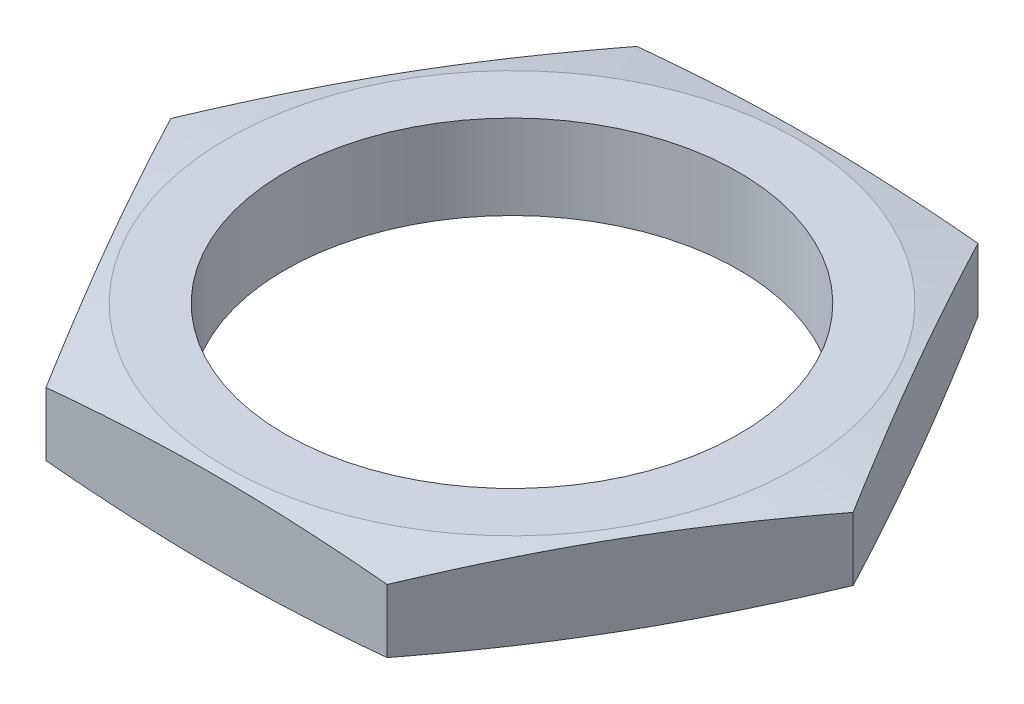
ISO-10303-21;
HEADER;
FILE_DESCRIPTION(('STEP AP214'),'2;1');
FILE_NAME('part.step','',(''),(''),'','','');
FILE_SCHEMA(('AUTOMOTIVE_DESIGN { 1 0 10303 214 1 1 1 1 }'));
ENDSEC;
DATA;
#1=APPLICATION_CONTEXT('core data for automotive mechanical design processes');
#2=APPLICATION_PROTOCOL_DEFINITION('international standard','automotive_design',2000,#1);
#3=PRODUCT_CONTEXT('',#1,'mechanical');
#4=PRODUCT('Part','Part','',(#3));
#5=PRODUCT_RELATED_PRODUCT_CATEGORY('part','',(#4));
#6=PRODUCT_DEFINITION_FORMATION('','',#4);
#7=PRODUCT_DEFINITION_CONTEXT('part definition',#1,'design');
#8=PRODUCT_DEFINITION('design','',#6,#7);
#9=PRODUCT_DEFINITION_SHAPE('','',#8);
#10=(LENGTH_UNIT() NAMED_UNIT(*) SI_UNIT(.MILLI.,.METRE.));
#11=(NAMED_UNIT(*) PLANE_ANGLE_UNIT() SI_UNIT($,.RADIAN.));
#12=(NAMED_UNIT(*) SI_UNIT($,.STERADIAN.) SOLID_ANGLE_UNIT());
#13=UNCERTAINTY_MEASURE_WITH_UNIT(LENGTH_MEASURE(1.E-05),#10,'distance_accuracy_value','');
#14=(GEOMETRIC_REPRESENTATION_CONTEXT(3) GLOBAL_UNCERTAINTY_ASSIGNED_CONTEXT((#13)) GLOBAL_UNIT_ASSIGNED_CONTEXT((#10,
#11,#12)) REPRESENTATION_CONTEXT('',''));
#15=CARTESIAN_POINT('',(0.,0.,0.));
#16=DIRECTION('',(0.,0.,1.));
#17=DIRECTION('',(1.,0.,0.));
#18=AXIS2_PLACEMENT_3D('',#15,#16,#17);
#19=CARTESIAN_POINT('',(16.1658075373095,4.,0.));
#20=DIRECTION('',(-0.866025403784439,0.,0.5));
#21=DIRECTION('',(0.5,0.,0.866025403784439));
#22=AXIS2_PLACEMENT_3D('',#19,#20,#21);
#23=PLANE('',#22);
#24=CARTESIAN_POINT('',(8.08278829860093,0.500021657844649,-14.0002));
#25=CARTESIAN_POINT('',(8.41903128372331,0.436928948181586,-13.4178100660794));
#26=CARTESIAN_POINT('',(8.7555755846297,0.379722239765142,-12.8348982379118));
#27=CARTESIAN_POINT('',(9.42924728603499,0.279299872724427,-11.6680646234564));
#28=CARTESIAN_POINT('',(9.76637478676281,0.236086923513849,-11.0841426635672));
#29=CARTESIAN_POINT('',(10.4402065165585,0.165986384294411,-9.91703187180905));
#30=CARTESIAN_POINT('',(10.7769096465145,0.139057616535367,-9.33384494365771));
#31=CARTESIAN_POINT('',(11.4505270834686,0.1029553465696,-8.16710531798885));
#32=CARTESIAN_POINT('',(11.7874413682254,0.0937802135004517,-7.58355265899443));
#33=CARTESIAN_POINT('',(12.4612699377389,0.0937802135004518,-6.41644734100557));
#34=CARTESIAN_POINT('',(12.7981842224956,0.1029553465696,-5.83289468201114));
#35=CARTESIAN_POINT('',(13.4718016594498,0.139057616535367,-4.66615505634229));
#36=CARTESIAN_POINT('',(13.8085047894058,0.16598638429441,-4.08296812819095));
#37=CARTESIAN_POINT('',(14.4823365192015,0.236086923513848,-2.91585733643283));
#38=CARTESIAN_POINT('',(14.8194640199293,0.279299872724427,-2.33193537654355));
#39=CARTESIAN_POINT('',(15.4931357213346,0.379722239765142,-1.16510176208821));
#40=CARTESIAN_POINT('',(15.829680022241,0.436928948181586,-0.582189933920597));
#41=CARTESIAN_POINT('',(16.1659230073634,0.500021657844649,0.000200000000002482));
#42=B_SPLINE_CURVE_WITH_KNOTS('',3,(#24,#25,#26,#27,#28,#29,#30,#31,#32,#33,#34,#35,#36,#37,#38,
#39,#40,#41),.UNSPECIFIED.,.F.,.F.,(4,2,2,2,2,2,2,2,4),(0.,2.02636732386575,4.0531267503307,
6.07473944983199,8.09616643363081,10.1175934174296,12.1392061169309,14.1659655433959,
16.1923328672616),.UNSPECIFIED.);
#43=CARTESIAN_POINT('',(8.08290376865475,0.5,-14.));
#44=VERTEX_POINT('',#43);
#45=CARTESIAN_POINT('',(16.1658075373095,0.5,0.));
#46=VERTEX_POINT('',#45);
#47=EDGE_CURVE('E50',#44,#46,#42,.T.);
#48=ORIENTED_EDGE('',*,*,#47,.F.);
#49=DIRECTION('',(0.,-1.,0.));
#50=VECTOR('',#49,1.);
#51=CARTESIAN_POINT('',(8.08290376865476,4.,-14.));
#52=LINE('',#51,#50);
#53=CARTESIAN_POINT('',(8.08290376865475,3.5,-14.));
#54=VERTEX_POINT('',#53);
#55=EDGE_CURVE('E11',#54,#44,#52,.T.);
#56=ORIENTED_EDGE('',*,*,#55,.F.);
#57=CARTESIAN_POINT('',(16.1659230073634,3.49997834215535,0.000200000000000044));
#58=CARTESIAN_POINT('',(15.829680022241,3.56307105181841,-0.582189933920598));
#59=CARTESIAN_POINT('',(15.4931357213346,3.62027776023486,-1.16510176208821));
#60=CARTESIAN_POINT('',(14.8194640199293,3.72070012727557,-2.33193537654355));
#61=CARTESIAN_POINT('',(14.4823365192015,3.76391307648615,-2.91585733643284));
#62=CARTESIAN_POINT('',(13.8085047894058,3.83401361570559,-4.08296812819095));
#63=CARTESIAN_POINT('',(13.4718016594498,3.86094238346463,-4.66615505634229));
#64=CARTESIAN_POINT('',(12.7981842224956,3.8970446534304,-5.83289468201115));
#65=CARTESIAN_POINT('',(12.4612699377389,3.90621978649955,-6.41644734100557));
#66=CARTESIAN_POINT('',(11.7874413682254,3.90621978649955,-7.58355265899443));
#67=CARTESIAN_POINT('',(11.4505270834686,3.8970446534304,-8.16710531798886));
#68=CARTESIAN_POINT('',(10.7769096465145,3.86094238346463,-9.33384494365771));
#69=CARTESIAN_POINT('',(10.4402065165585,3.83401361570559,-9.91703187180905));
#70=CARTESIAN_POINT('',(9.76637478676281,3.76391307648615,-11.0841426635672));
#71=CARTESIAN_POINT('',(9.42924728603499,3.72070012727557,-11.6680646234565));
#72=CARTESIAN_POINT('',(8.7555755846297,3.62027776023486,-12.8348982379118));
#73=CARTESIAN_POINT('',(8.41903128372331,3.56307105181841,-13.4178100660794));
#74=CARTESIAN_POINT('',(8.08278829860093,3.49997834215535,-14.0002));
#75=B_SPLINE_CURVE_WITH_KNOTS('',3,(#57,#58,#59,#60,#61,#62,#63,#64,#65,#66,#67,#68,#69,#70,#71,
#72,#73,#74),.UNSPECIFIED.,.F.,.F.,(4,2,2,2,2,2,2,2,4),(0.,2.02636732386574,4.0531267503307,
6.07473944983199,8.09616643363081,10.1175934174296,12.1392061169309,14.1659655433959,
16.1923328672616),.UNSPECIFIED.);
#76=CARTESIAN_POINT('',(16.1658075373095,3.5,0.));
#77=VERTEX_POINT('',#76);
#78=EDGE_CURVE('E106',#77,#54,#75,.T.);
#79=ORIENTED_EDGE('',*,*,#78,.F.);
#80=DIRECTION('',(0.,-1.,0.));
#81=VECTOR('',#80,1.);
#82=CARTESIAN_POINT('',(16.1658075373095,4.,0.));
#83=LINE('',#82,#81);
#84=EDGE_CURVE('E99',#77,#46,#83,.T.);
#85=ORIENTED_EDGE('',*,*,#84,.T.);
#86=EDGE_LOOP('',(#48,#56,#79,#85));
#87=FACE_BOUND('',#86,.T.);
#88=ADVANCED_FACE('F35',(#87),#23,.F.);
#89=CARTESIAN_POINT('',(8.08290376865476,4.,-14.));
#90=DIRECTION('',(0.,0.,1.));
#91=DIRECTION('',(1.,0.,0.));
#92=AXIS2_PLACEMENT_3D('',#89,#90,#91);
#93=PLANE('',#92);
#94=CARTESIAN_POINT('',(-21.3411155634247,2.25511134082577,-14.));
#95=CARTESIAN_POINT('',(-20.7058129429387,2.15550496916558,-14.));
#96=CARTESIAN_POINT('',(-20.0703097090309,2.05715550984232,-14.));
#97=CARTESIAN_POINT('',(-18.7988056075274,1.86363684383851,-14.));
#98=CARTESIAN_POINT('',(-18.1628047293868,1.76846770652341,-14.));
#99=CARTESIAN_POINT('',(-16.8899295173374,1.58193550887261,-14.));
#100=CARTESIAN_POINT('',(-16.2530549100121,1.4905743077123,-14.));
#101=CARTESIAN_POINT('',(-14.9786434654476,1.3125966688758,-14.));
#102=CARTESIAN_POINT('',(-14.3411066310614,1.22598021084411,-14.));
#103=CARTESIAN_POINT('',(-13.0676924405478,1.05891235972249,-14.));
#104=CARTESIAN_POINT('',(-12.4318180151575,0.97843873713209,-14.));
#105=CARTESIAN_POINT('',(-11.1591982105789,0.824641831680371,-14.));
#106=CARTESIAN_POINT('',(-10.5224528297147,0.751318562598315,-14.));
#107=CARTESIAN_POINT('',(-9.24805027735395,0.613449400079334,-14.));
#108=CARTESIAN_POINT('',(-8.61039317394871,0.548902882555688,-14.));
#109=CARTESIAN_POINT('',(-7.334081101819,0.430447372860344,-14.));
#110=CARTESIAN_POINT('',(-6.69542613343784,0.376538377029623,-14.));
#111=CARTESIAN_POINT('',(-5.41374366770995,0.281097514062404,-14.));
#112=CARTESIAN_POINT('',(-4.77071105422246,0.239633391712697,-14.));
#113=CARTESIAN_POINT('',(-3.48386041949211,0.171386901474243,-14.));
#114=CARTESIAN_POINT('',(-2.84004240609005,0.144604388198631,-14.));
#115=CARTESIAN_POINT('',(-1.55206224393307,0.107173239295152,-14.));
#116=CARTESIAN_POINT('',(-0.907900194322149,0.0965212566311662,-14.));
#117=CARTESIAN_POINT('',(0.38048384620744,0.091970753987886,-14.));
#118=CARTESIAN_POINT('',(1.02470583708786,0.0980722233911847,-14.));
#119=CARTESIAN_POINT('',(2.31392160660075,0.126689113047616,-14.));
#120=CARTESIAN_POINT('',(2.95891472669225,0.149233635445284,-14.));
#121=CARTESIAN_POINT('',(4.2481844986548,0.209506894102796,-14.));
#122=CARTESIAN_POINT('',(4.89246114382584,0.247235771179155,-14.));
#123=CARTESIAN_POINT('',(6.180268449355,0.336056103289326,-14.));
#124=CARTESIAN_POINT('',(6.82379883608137,0.387151467323396,-14.));
#125=CARTESIAN_POINT('',(8.10984993950409,0.500662396150294,-14.));
#126=CARTESIAN_POINT('',(8.75237065430104,0.563077982213137,-14.));
#127=CARTESIAN_POINT('',(10.0004580480839,0.693514810240626,-14.));
#128=CARTESIAN_POINT('',(10.6060785454299,0.761026161819565,-14.));
#129=CARTESIAN_POINT('',(11.8165159342086,0.902937684760817,-14.));
#130=CARTESIAN_POINT('',(12.4213328140225,0.977337954647116,-14.));
#131=CARTESIAN_POINT('',(13.6302733254929,1.13179414554823,-14.));
#132=CARTESIAN_POINT('',(14.2343969182125,1.21185036979902,-14.));
#133=CARTESIAN_POINT('',(15.4420068020443,1.37659600713995,-14.));
#134=CARTESIAN_POINT('',(16.0454930961187,1.46128539859772,-14.));
#135=CARTESIAN_POINT('',(17.2520165523451,1.63448378457692,-14.));
#136=CARTESIAN_POINT('',(17.8550536248724,1.7229934016864,-14.));
#137=CARTESIAN_POINT('',(19.0606583326001,1.90315868476258,-14.));
#138=CARTESIAN_POINT('',(19.6632259663328,1.99481436052576,-14.));
#139=CARTESIAN_POINT('',(21.4702857796518,2.27366275081374,-14.));
#140=CARTESIAN_POINT('',(22.6741778180284,2.4647430775665,-14.));
#141=CARTESIAN_POINT('',(25.0749930239485,2.85320630082681,-14.));
#142=CARTESIAN_POINT('',(26.2719218515873,3.05055444911091,-14.));
#143=CARTESIAN_POINT('',(28.6649218825801,3.45044386649273,-14.));
#144=CARTESIAN_POINT('',(29.8609930775925,3.65298518541461,-14.));
#145=CARTESIAN_POINT('',(32.2516442648111,4.06176446577771,-14.));
#146=CARTESIAN_POINT('',(33.4462247153245,4.26799975228896,-14.));
#147=CARTESIAN_POINT('',(35.2377050500015,4.57953237476335,-14.));
#148=CARTESIAN_POINT('',(35.8347949755792,4.68373895955804,-14.));
#149=CARTESIAN_POINT('',(37.0288619694167,4.89279477598603,-14.));
#150=CARTESIAN_POINT('',(37.625839037742,4.99764400724427,-14.));
#151=CARTESIAN_POINT('',(38.222766941432,5.10277237897569,-14.));
#152=B_SPLINE_CURVE_WITH_KNOTS('',3,(#94,#95,#96,#97,#98,#99,#100,#101,#102,#103,#104,#105,#106,
#107,#108,#109,#110,#111,#112,#113,#114,#115,#116,#117,#118,#119,#120,#121,#122,#123,#124,#125,
#126,#127,#128,#129,#130,#131,#132,#133,#134,#135,#136,#137,#138,#139,#140,#141,#142,#143,#144,
#145,#146,#147,#148,#149,#150,#151),.UNSPECIFIED.,.F.,.F.,(4,2,2,2,2,2,2,2,2,2,2,2,2,2,2,2,2,2,
2,2,2,2,2,2,2,2,2,2,4),(0.,1.92919491827861,3.85843188646111,5.78860000214864,7.7187598365368,
9.64156648555036,11.5643768398814,13.4870503977419,15.4097232942529,17.3426801364594,
19.2756178369214,21.208154403697,23.1406897457385,25.0766537588627,27.0126357261243,
28.9491845013061,30.885736915184,32.7138057489581,34.5419007314613,36.3700937991686,
38.1982783317241,40.0267619396983,41.8552512418766,45.5120996543971,49.15135323161,
52.7906417375313,56.4273936833893,58.2457384064187,60.0640820683674),.UNSPECIFIED.);
#153=CARTESIAN_POINT('',(-8.08290376865476,0.5,-14.));
#154=VERTEX_POINT('',#153);
#155=EDGE_CURVE('E86',#154,#44,#152,.T.);
#156=ORIENTED_EDGE('',*,*,#155,.F.);
#157=DIRECTION('',(0.,-1.,0.));
#158=VECTOR('',#157,1.);
#159=CARTESIAN_POINT('',(-8.08290376865476,4.,-14.));
#160=LINE('',#159,#158);
#161=CARTESIAN_POINT('',(-8.08290376865476,3.5,-14.));
#162=VERTEX_POINT('',#161);
#163=EDGE_CURVE('E43',#162,#154,#160,.T.);
#164=ORIENTED_EDGE('',*,*,#163,.F.);
#165=CARTESIAN_POINT('',(-21.3411155634247,1.74488865917423,-14.));
#166=CARTESIAN_POINT('',(-20.7058129429387,1.84449503083442,-14.));
#167=CARTESIAN_POINT('',(-20.0703097090309,1.94284449015768,-14.));
#168=CARTESIAN_POINT('',(-18.7988056075274,2.13636315616149,-14.));
#169=CARTESIAN_POINT('',(-18.1628047293868,2.23153229347659,-14.));
#170=CARTESIAN_POINT('',(-16.8899295173374,2.41806449112739,-14.));
#171=CARTESIAN_POINT('',(-16.2530549100121,2.5094256922877,-14.));
#172=CARTESIAN_POINT('',(-14.9786434654475,2.6874033311242,-14.));
#173=CARTESIAN_POINT('',(-14.3411066310614,2.77401978915589,-14.));
#174=CARTESIAN_POINT('',(-13.0676924405478,2.94108764027751,-14.));
#175=CARTESIAN_POINT('',(-12.4318180151575,3.02156126286791,-14.));
#176=CARTESIAN_POINT('',(-11.1591982105789,3.17535816831963,-14.));
#177=CARTESIAN_POINT('',(-10.5224528297147,3.24868143740169,-14.));
#178=CARTESIAN_POINT('',(-9.24805027735395,3.38655059992067,-14.));
#179=CARTESIAN_POINT('',(-8.61039317394871,3.45109711744431,-14.));
#180=CARTESIAN_POINT('',(-7.33408110181899,3.56955262713966,-14.));
#181=CARTESIAN_POINT('',(-6.69542613343784,3.62346162297038,-14.));
#182=CARTESIAN_POINT('',(-5.41374366770995,3.7189024859376,-14.));
#183=CARTESIAN_POINT('',(-4.77071105422246,3.7603666082873,-14.));
#184=CARTESIAN_POINT('',(-3.48386041949211,3.82861309852576,-14.));
#185=CARTESIAN_POINT('',(-2.84004240609005,3.85539561180137,-14.));
#186=CARTESIAN_POINT('',(-1.55206224393307,3.89282676070485,-14.));
#187=CARTESIAN_POINT('',(-0.90790019432215,3.90347874336883,-14.));
#188=CARTESIAN_POINT('',(0.380483846207441,3.90802924601211,-14.));
#189=CARTESIAN_POINT('',(1.02470583708786,3.90192777660881,-14.));
#190=CARTESIAN_POINT('',(2.31392160660075,3.87331088695238,-14.));
#191=CARTESIAN_POINT('',(2.95891472669226,3.85076636455472,-14.));
#192=CARTESIAN_POINT('',(4.2481844986548,3.7904931058972,-14.));
#193=CARTESIAN_POINT('',(4.89246114382584,3.75276422882084,-14.));
#194=CARTESIAN_POINT('',(6.180268449355,3.66394389671067,-14.));
#195=CARTESIAN_POINT('',(6.82379883608137,3.6128485326766,-14.));
#196=CARTESIAN_POINT('',(8.10984993950409,3.49933760384971,-14.));
#197=CARTESIAN_POINT('',(8.75237065430104,3.43692201778686,-14.));
#198=CARTESIAN_POINT('',(10.0004580480839,3.30648518975937,-14.));
#199=CARTESIAN_POINT('',(10.6060785454299,3.23897383818043,-14.));
#200=CARTESIAN_POINT('',(11.8165159342086,3.09706231523918,-14.));
#201=CARTESIAN_POINT('',(12.4213328140225,3.02266204535288,-14.));
#202=CARTESIAN_POINT('',(13.6302733254929,2.86820585445177,-14.));
#203=CARTESIAN_POINT('',(14.2343969182125,2.78814963020098,-14.));
#204=CARTESIAN_POINT('',(15.4420068020443,2.62340399286005,-14.));
#205=CARTESIAN_POINT('',(16.0454930961187,2.53871460140227,-14.));
#206=CARTESIAN_POINT('',(17.2520165523451,2.36551621542308,-14.));
#207=CARTESIAN_POINT('',(17.8550536248724,2.2770065983136,-14.));
#208=CARTESIAN_POINT('',(19.0606583326001,2.09684131523741,-14.));
#209=CARTESIAN_POINT('',(19.6632259663328,2.00518563947424,-14.));
#210=CARTESIAN_POINT('',(21.4702857796518,1.72633724918626,-14.));
#211=CARTESIAN_POINT('',(22.6741778180284,1.53525692243349,-14.));
#212=CARTESIAN_POINT('',(25.0749930239485,1.14679369917319,-14.));
#213=CARTESIAN_POINT('',(26.2719218515873,0.94944555088908,-14.));
#214=CARTESIAN_POINT('',(28.6649218825801,0.549556133507272,-14.));
#215=CARTESIAN_POINT('',(29.8609930775925,0.347014814585387,-14.));
#216=CARTESIAN_POINT('',(32.2516442648111,-0.061764465777715,-14.));
#217=CARTESIAN_POINT('',(33.4462247153245,-0.267999752288968,-14.));
#218=CARTESIAN_POINT('',(35.2377050500015,-0.579532374763347,-14.));
#219=CARTESIAN_POINT('',(35.8347949755792,-0.683738959558042,-14.));
#220=CARTESIAN_POINT('',(37.0288619694166,-0.892794775986026,-14.));
#221=CARTESIAN_POINT('',(37.625839037742,-0.997644007244269,-14.));
#222=CARTESIAN_POINT('',(38.222766941432,-1.10277237897569,-14.));
#223=B_SPLINE_CURVE_WITH_KNOTS('',3,(#165,#166,#167,#168,#169,#170,#171,#172,#173,#174,#175,
#176,#177,#178,#179,#180,#181,#182,#183,#184,#185,#186,#187,#188,#189,#190,#191,#192,#193,#194,
#195,#196,#197,#198,#199,#200,#201,#202,#203,#204,#205,#206,#207,#208,#209,#210,#211,#212,#213,
#214,#215,#216,#217,#218,#219,#220,#221,#222),.UNSPECIFIED.,.F.,.F.,(4,2,2,2,2,2,2,2,2,2,2,2,2,
2,2,2,2,2,2,2,2,2,2,2,2,2,2,2,4),(0.,1.92919491827861,3.85843188646112,5.78860000214865,
7.71875983653681,9.64156648555037,11.5643768398814,13.4870503977419,15.4097232942529,
17.3426801364594,19.2756178369214,21.208154403697,23.1406897457385,25.0766537588627,
27.0126357261243,28.9491845013061,30.885736915184,32.7138057489581,34.5419007314613,
36.3700937991686,38.1982783317241,40.0267619396983,41.8552512418766,45.5120996543972,
49.15135323161,52.7906417375313,56.4273936833893,58.2457384064187,60.0640820683674),.UNSPECIFIED.);
#224=EDGE_CURVE('E104',#54,#162,#223,.F.);
#225=ORIENTED_EDGE('',*,*,#224,.F.);
#226=ORIENTED_EDGE('',*,*,#55,.T.);
#227=EDGE_LOOP('',(#156,#164,#225,#226));
#228=FACE_BOUND('',#227,.T.);
#229=ADVANCED_FACE('F103',(#228),#93,.F.);
#230=CARTESIAN_POINT('',(-8.08290376865476,4.,-14.));
#231=DIRECTION('',(0.866025403784439,0.,0.5));
#232=DIRECTION('',(0.5,0.,-0.866025403784439));
#233=AXIS2_PLACEMENT_3D('',#230,#231,#232);
#234=PLANE('',#233);
#235=CARTESIAN_POINT('',(-16.1659230073634,0.500021657844648,0.000199999999996531));
#236=CARTESIAN_POINT('',(-15.829680022241,0.436928948181585,-0.582189933920602));
#237=CARTESIAN_POINT('',(-15.4931357213346,0.379722239765141,-1.16510176208822));
#238=CARTESIAN_POINT('',(-14.8194640199293,0.279299872724426,-2.33193537654355));
#239=CARTESIAN_POINT('',(-14.4823365192015,0.236086923513848,-2.91585733643284));
#240=CARTESIAN_POINT('',(-13.8085047894058,0.16598638429441,-4.08296812819095));
#241=CARTESIAN_POINT('',(-13.4718016594498,0.139057616535366,-4.6661550563423));
#242=CARTESIAN_POINT('',(-12.7981842224956,0.102955346569599,-5.83289468201115));
#243=CARTESIAN_POINT('',(-12.4612699377389,0.0937802135004515,-6.41644734100557));
#244=CARTESIAN_POINT('',(-11.7874413682254,0.0937802135004516,-7.58355265899443));
#245=CARTESIAN_POINT('',(-11.4505270834686,0.1029553465696,-8.16710531798886));
#246=CARTESIAN_POINT('',(-10.7769096465145,0.139057616535367,-9.33384494365771));
#247=CARTESIAN_POINT('',(-10.4402065165585,0.16598638429441,-9.91703187180905));
#248=CARTESIAN_POINT('',(-9.7663747867628,0.236086923513849,-11.0841426635672));
#249=CARTESIAN_POINT('',(-9.42924728603499,0.279299872724427,-11.6680646234565));
#250=CARTESIAN_POINT('',(-8.7555755846297,0.379722239765142,-12.8348982379118));
#251=CARTESIAN_POINT('',(-8.41903128372331,0.436928948181586,-13.4178100660794));
#252=CARTESIAN_POINT('',(-8.08278829860092,0.500021657844649,-14.0002));
#253=B_SPLINE_CURVE_WITH_KNOTS('',3,(#235,#236,#237,#238,#239,#240,#241,#242,#243,#244,#245,
#246,#247,#248,#249,#250,#251,#252),.UNSPECIFIED.,.F.,.F.,(4,2,2,2,2,2,2,2,4),(0.,
2.02636732386574,4.0531267503307,6.07473944983199,8.09616643363081,10.1175934174296,
12.1392061169309,14.1659655433959,16.1923328672616),.UNSPECIFIED.);
#254=CARTESIAN_POINT('',(-16.1658075373095,0.5,0.));
#255=VERTEX_POINT('',#254);
#256=EDGE_CURVE('E89',#255,#154,#253,.T.);
#257=ORIENTED_EDGE('',*,*,#256,.F.);
#258=DIRECTION('',(0.,-1.,0.));
#259=VECTOR('',#258,1.);
#260=CARTESIAN_POINT('',(-16.1658075373095,4.,0.));
#261=LINE('',#260,#259);
#262=CARTESIAN_POINT('',(-16.1658075373095,3.5,0.));
#263=VERTEX_POINT('',#262);
#264=EDGE_CURVE('E292',#263,#255,#261,.T.);
#265=ORIENTED_EDGE('',*,*,#264,.F.);
#266=CARTESIAN_POINT('',(-8.08278829860092,3.49997834215535,-14.0002));
#267=CARTESIAN_POINT('',(-8.41903128372331,3.56307105181841,-13.4178100660794));
#268=CARTESIAN_POINT('',(-8.7555755846297,3.62027776023486,-12.8348982379118));
#269=CARTESIAN_POINT('',(-9.42924728603499,3.72070012727557,-11.6680646234564));
#270=CARTESIAN_POINT('',(-9.7663747867628,3.76391307648615,-11.0841426635672));
#271=CARTESIAN_POINT('',(-10.4402065165585,3.83401361570559,-9.91703187180905));
#272=CARTESIAN_POINT('',(-10.7769096465145,3.86094238346463,-9.33384494365771));
#273=CARTESIAN_POINT('',(-11.4505270834686,3.8970446534304,-8.16710531798886));
#274=CARTESIAN_POINT('',(-11.7874413682254,3.90621978649955,-7.58355265899443));
#275=CARTESIAN_POINT('',(-12.4612699377389,3.90621978649955,-6.41644734100558));
#276=CARTESIAN_POINT('',(-12.7981842224956,3.8970446534304,-5.83289468201115));
#277=CARTESIAN_POINT('',(-13.4718016594498,3.86094238346463,-4.6661550563423));
#278=CARTESIAN_POINT('',(-13.8085047894058,3.83401361570559,-4.08296812819095));
#279=CARTESIAN_POINT('',(-14.4823365192015,3.76391307648615,-2.91585733643284));
#280=CARTESIAN_POINT('',(-14.8194640199293,3.72070012727557,-2.33193537654355));
#281=CARTESIAN_POINT('',(-15.4931357213346,3.62027776023486,-1.16510176208822));
#282=CARTESIAN_POINT('',(-15.829680022241,3.56307105181842,-0.582189933920603));
#283=CARTESIAN_POINT('',(-16.1659230073634,3.49997834215535,0.000199999999996623));
#284=B_SPLINE_CURVE_WITH_KNOTS('',3,(#266,#267,#268,#269,#270,#271,#272,#273,#274,#275,#276,
#277,#278,#279,#280,#281,#282,#283),.UNSPECIFIED.,.F.,.F.,(4,2,2,2,2,2,2,2,4),(0.,
2.02636732386575,4.0531267503307,6.07473944983199,8.09616643363082,10.1175934174296,
12.1392061169309,14.1659655433959,16.1923328672616),.UNSPECIFIED.);
#285=EDGE_CURVE('E107',#162,#263,#284,.T.);
#286=ORIENTED_EDGE('',*,*,#285,.F.);
#287=ORIENTED_EDGE('',*,*,#163,.T.);
#288=EDGE_LOOP('',(#257,#265,#286,#287));
#289=FACE_BOUND('',#288,.T.);
#290=ADVANCED_FACE('F132',(#289),#234,.F.);
#291=CARTESIAN_POINT('',(-16.1658075373095,4.,0.));
#292=DIRECTION('',(0.866025403784439,0.,-0.5));
#293=DIRECTION('',(-0.5,0.,-0.866025403784439));
#294=AXIS2_PLACEMENT_3D('',#291,#292,#293);
#295=PLANE('',#294);
#296=CARTESIAN_POINT('',(-8.08278829860091,0.500021657844648,14.0002));
#297=CARTESIAN_POINT('',(-8.4190312837233,0.436928948181585,13.4178100660794));
#298=CARTESIAN_POINT('',(-8.75557558462969,0.379722239765141,12.8348982379118));
#299=CARTESIAN_POINT('',(-9.42924728603498,0.279299872724426,11.6680646234565));
#300=CARTESIAN_POINT('',(-9.76637478676279,0.236086923513848,11.0841426635672));
#301=CARTESIAN_POINT('',(-10.4402065165585,0.16598638429441,9.91703187180905));
#302=CARTESIAN_POINT('',(-10.7769096465145,0.139057616535366,9.33384494365771));
#303=CARTESIAN_POINT('',(-11.4505270834686,0.102955346569599,8.16710531798886));
#304=CARTESIAN_POINT('',(-11.7874413682254,0.0937802135004503,7.58355265899443));
#305=CARTESIAN_POINT('',(-12.4612699377389,0.0937802135004503,6.41644734100557));
#306=CARTESIAN_POINT('',(-12.7981842224956,0.102955346569599,5.83289468201114));
#307=CARTESIAN_POINT('',(-13.4718016594498,0.139057616535366,4.66615505634229));
#308=CARTESIAN_POINT('',(-13.8085047894058,0.165986384294409,4.08296812819095));
#309=CARTESIAN_POINT('',(-14.4823365192015,0.236086923513847,2.91585733643283));
#310=CARTESIAN_POINT('',(-14.8194640199293,0.279299872724426,2.33193537654355));
#311=CARTESIAN_POINT('',(-15.4931357213346,0.379722239765141,1.16510176208821));
#312=CARTESIAN_POINT('',(-15.829680022241,0.436928948181585,0.582189933920595));
#313=CARTESIAN_POINT('',(-16.1659230073634,0.500021657844648,-0.000200000000004515));
#314=B_SPLINE_CURVE_WITH_KNOTS('',3,(#296,#297,#298,#299,#300,#301,#302,#303,#304,#305,#306,
#307,#308,#309,#310,#311,#312,#313),.UNSPECIFIED.,.F.,.F.,(4,2,2,2,2,2,2,2,4),(0.,
2.02636732386575,4.0531267503307,6.07473944983199,8.09616643363082,10.1175934174296,
12.1392061169309,14.1659655433959,16.1923328672616),.UNSPECIFIED.);
#315=CARTESIAN_POINT('',(-8.08290376865474,0.5,14.));
#316=VERTEX_POINT('',#315);
#317=EDGE_CURVE('E169',#316,#255,#314,.T.);
#318=ORIENTED_EDGE('',*,*,#317,.F.);
#319=DIRECTION('',(0.,-1.,0.));
#320=VECTOR('',#319,1.);
#321=CARTESIAN_POINT('',(-8.08290376865475,4.,14.));
#322=LINE('',#321,#320);
#323=CARTESIAN_POINT('',(-8.08290376865475,3.5,14.));
#324=VERTEX_POINT('',#323);
#325=EDGE_CURVE('E289',#324,#316,#322,.T.);
#326=ORIENTED_EDGE('',*,*,#325,.F.);
#327=CARTESIAN_POINT('',(-16.1659230073634,3.49997834215535,-0.000200000000003531));
#328=CARTESIAN_POINT('',(-15.829680022241,3.56307105181842,0.582189933920595));
#329=CARTESIAN_POINT('',(-15.4931357213346,3.62027776023486,1.16510176208821));
#330=CARTESIAN_POINT('',(-14.8194640199293,3.72070012727557,2.33193537654355));
#331=CARTESIAN_POINT('',(-14.4823365192015,3.76391307648615,2.91585733643283));
#332=CARTESIAN_POINT('',(-13.8085047894058,3.83401361570559,4.08296812819095));
#333=CARTESIAN_POINT('',(-13.4718016594498,3.86094238346463,4.66615505634229));
#334=CARTESIAN_POINT('',(-12.7981842224956,3.8970446534304,5.83289468201115));
#335=CARTESIAN_POINT('',(-12.4612699377389,3.90621978649955,6.41644734100557));
#336=CARTESIAN_POINT('',(-11.7874413682254,3.90621978649955,7.58355265899443));
#337=CARTESIAN_POINT('',(-11.4505270834686,3.8970446534304,8.16710531798886));
#338=CARTESIAN_POINT('',(-10.7769096465145,3.86094238346463,9.33384494365771));
#339=CARTESIAN_POINT('',(-10.4402065165585,3.83401361570559,9.91703187180905));
#340=CARTESIAN_POINT('',(-9.76637478676279,3.76391307648615,11.0841426635672));
#341=CARTESIAN_POINT('',(-9.42924728603498,3.72070012727557,11.6680646234565));
#342=CARTESIAN_POINT('',(-8.75557558462969,3.62027776023486,12.8348982379118));
#343=CARTESIAN_POINT('',(-8.4190312837233,3.56307105181841,13.4178100660794));
#344=CARTESIAN_POINT('',(-8.08278829860091,3.49997834215535,14.0002));
#345=B_SPLINE_CURVE_WITH_KNOTS('',3,(#327,#328,#329,#330,#331,#332,#333,#334,#335,#336,#337,
#338,#339,#340,#341,#342,#343,#344),.UNSPECIFIED.,.F.,.F.,(4,2,2,2,2,2,2,2,4),(0.,
2.02636732386575,4.0531267503307,6.074739449832,8.09616643363082,10.1175934174296,
12.1392061169309,14.1659655433959,16.1923328672616),.UNSPECIFIED.);
#346=EDGE_CURVE('E111',#263,#324,#345,.T.);
#347=ORIENTED_EDGE('',*,*,#346,.F.);
#348=ORIENTED_EDGE('',*,*,#264,.T.);
#349=EDGE_LOOP('',(#318,#326,#347,#348));
#350=FACE_BOUND('',#349,.T.);
#351=ADVANCED_FACE('F173',(#350),#295,.F.);
#352=CARTESIAN_POINT('',(-8.08290376865475,4.,14.));
#353=DIRECTION('',(0.,0.,-1.));
#354=DIRECTION('',(-1.,0.,0.));
#355=AXIS2_PLACEMENT_3D('',#352,#353,#354);
#356=PLANE('',#355);
#357=CARTESIAN_POINT('',(-21.3411112485993,2.25511066414589,14.));
#358=CARTESIAN_POINT('',(-20.7058088051596,2.15550432629498,14.));
#359=CARTESIAN_POINT('',(-20.0703057483327,2.05715490064241,14.));
#360=CARTESIAN_POINT('',(-18.7988020011116,1.86363630143501,14.));
#361=CARTESIAN_POINT('',(-18.1628013001727,1.76846719724561,14.));
#362=CARTESIAN_POINT('',(-16.8899264429817,1.58193506507774,14.));
#363=CARTESIAN_POINT('',(-16.2530520133133,1.49057389627302,14.));
#364=CARTESIAN_POINT('',(-14.9786409242894,1.31259632089874,14.));
#365=CARTESIAN_POINT('',(-14.3411042677868,1.22597989397368,14.));
#366=CARTESIAN_POINT('',(-13.0676904311048,1.05891210288062,14.));
#367=CARTESIAN_POINT('',(-12.4318161816597,0.978438509233536,14.));
#368=CARTESIAN_POINT('',(-11.159196729371,0.824641658994945,14.));
#369=CARTESIAN_POINT('',(-10.5224515248515,0.751318416182684,14.));
#370=CARTESIAN_POINT('',(-9.24804932560674,0.613449302365566,14.));
#371=CARTESIAN_POINT('',(-8.6103923989727,0.548902807275016,14.));
#372=CARTESIAN_POINT('',(-7.33408068094471,0.430447337151434,14.));
#373=CARTESIAN_POINT('',(-6.69542588989407,0.376538358459363,14.));
#374=CARTESIAN_POINT('',(-5.4137437883172,0.281097523480124,14.));
#375=CARTESIAN_POINT('',(-4.77071136166513,0.239633411783516,14.));
#376=CARTESIAN_POINT('',(-3.48386110099964,0.171386933854601,14.));
#377=CARTESIAN_POINT('',(-2.84004327482701,0.144604422235752,14.));
#378=CARTESIAN_POINT('',(-1.55206348709031,0.107173266641274,14.));
#379=CARTESIAN_POINT('',(-0.907901624670163,0.0965212756335442,14.));
#380=CARTESIAN_POINT('',(0.380482041807731,0.0919707464116999,14.));
#381=CARTESIAN_POINT('',(1.02470384582723,0.0980721975800794,14.));
#382=CARTESIAN_POINT('',(2.31391924160535,0.126689042120371,14.));
#383=CARTESIAN_POINT('',(2.95891217482441,0.149233537612438,14.));
#384=CARTESIAN_POINT('',(4.24818157386401,0.209506735883105,14.));
#385=CARTESIAN_POINT('',(4.89245803298454,0.247235579477952,14.));
#386=CARTESIAN_POINT('',(6.18026496696672,0.336055840227809,14.));
#387=CARTESIAN_POINT('',(6.8237951681971,0.38715116637801,14.));
#388=CARTESIAN_POINT('',(8.10984590126064,0.500662016913054,14.));
#389=CARTESIAN_POINT('',(8.7523664311944,0.563077562567928,14.));
#390=CARTESIAN_POINT('',(10.0004536423964,0.693514329310042,14.));
#391=CARTESIAN_POINT('',(10.6060741417441,0.761025662504902,14.));
#392=CARTESIAN_POINT('',(11.8165115343397,0.902937151946049,14.));
#393=CARTESIAN_POINT('',(12.4213284159689,0.977337406716481,14.));
#394=CARTESIAN_POINT('',(13.630268930891,1.13179357011576,14.));
#395=CARTESIAN_POINT('',(14.234392525247,1.21184978198111,14.));
#396=CARTESIAN_POINT('',(15.4420024121309,1.37659539677584,14.));
#397=CARTESIAN_POINT('',(16.0454887076211,1.46128477807281,14.));
#398=CARTESIAN_POINT('',(17.2520121668476,1.63448314557718,14.));
#399=CARTESIAN_POINT('',(17.8550492409588,1.72299275437526,14.));
#400=CARTESIAN_POINT('',(19.0606539516792,1.90315802227842,14.));
#401=CARTESIAN_POINT('',(19.6632215868206,1.99481369117998,14.));
#402=CARTESIAN_POINT('',(21.4702814040948,2.27366206260813,14.));
#403=CARTESIAN_POINT('',(22.6741734447923,2.46474237909361,14.));
#404=CARTESIAN_POINT('',(25.0749886577111,2.85320558530069,14.));
#405=CARTESIAN_POINT('',(26.2719174900271,3.05055372680131,14.));
#406=CARTESIAN_POINT('',(28.6649175300785,3.45044313261837,14.));
#407=CARTESIAN_POINT('',(29.8609887294725,3.65298444675906,14.));
#408=CARTESIAN_POINT('',(32.2516399238902,4.06176371869811,14.));
#409=CARTESIAN_POINT('',(33.4462203772221,4.26799900156125,14.));
#410=CARTESIAN_POINT('',(35.2377007159992,4.5795316192756,14.));
#411=CARTESIAN_POINT('',(35.8347906429177,4.68373820260148,14.));
#412=CARTESIAN_POINT('',(37.0288576394024,4.89279401629515,14.));
#413=CARTESIAN_POINT('',(37.6258347090344,4.99764324628791,14.));
#414=CARTESIAN_POINT('',(38.2227626140167,5.10277161683826,14.));
#415=B_SPLINE_CURVE_WITH_KNOTS('',3,(#357,#358,#359,#360,#361,#362,#363,#364,#365,#366,#367,
#368,#369,#370,#371,#372,#373,#374,#375,#376,#377,#378,#379,#380,#381,#382,#383,#384,#385,#386,
#387,#388,#389,#390,#391,#392,#393,#394,#395,#396,#397,#398,#399,#400,#401,#402,#403,#404,#405,
#406,#407,#408,#409,#410,#411,#412,#413,#414),.UNSPECIFIED.,.F.,.F.,(4,2,2,2,2,2,2,2,2,2,2,2,2,
2,2,2,2,2,2,2,2,2,2,2,2,2,2,2,4),(0.,1.92919437783807,3.85843080556331,5.7885983798998,
7.71875767293874,9.64156378740503,11.5643736071854,13.4870466306988,15.4097189928598,
17.3426752737985,19.275612413029,21.2081484189221,23.1406832000695,25.0766466502316,
27.0126280544992,28.9491762659731,30.8857281161455,32.7137969497291,34.5418919320711,
36.3700849997429,38.1982695322545,40.0267531412999,41.855242444555,45.512090859092,
49.1513444468283,52.7906329633085,56.4273849156335,58.2457296418674,60.0640733070199),.UNSPECIFIED.);
#416=CARTESIAN_POINT('',(8.08290376865478,0.5,14.));
#417=VERTEX_POINT('',#416);
#418=EDGE_CURVE('E163',#417,#316,#415,.F.);
#419=ORIENTED_EDGE('',*,*,#418,.F.);
#420=DIRECTION('',(0.,-1.,0.));
#421=VECTOR('',#420,1.);
#422=CARTESIAN_POINT('',(8.08290376865476,4.,14.));
#423=LINE('',#422,#421);
#424=CARTESIAN_POINT('',(8.08290376865476,3.5,14.));
#425=VERTEX_POINT('',#424);
#426=EDGE_CURVE('E287',#425,#417,#423,.T.);
#427=ORIENTED_EDGE('',*,*,#426,.F.);
#428=CARTESIAN_POINT('',(-21.3411112485993,1.74488933585411,14.));
#429=CARTESIAN_POINT('',(-20.7058088051596,1.84449567370502,14.));
#430=CARTESIAN_POINT('',(-20.0703057483327,1.94284509935759,14.));
#431=CARTESIAN_POINT('',(-18.7988020011116,2.13636369856499,14.));
#432=CARTESIAN_POINT('',(-18.1628013001727,2.23153280275439,14.));
#433=CARTESIAN_POINT('',(-16.8899264429817,2.41806493492226,14.));
#434=CARTESIAN_POINT('',(-16.2530520133133,2.50942610372698,14.));
#435=CARTESIAN_POINT('',(-14.9786409242894,2.68740367910126,14.));
#436=CARTESIAN_POINT('',(-14.3411042677868,2.77402010602632,14.));
#437=CARTESIAN_POINT('',(-13.0676904311048,2.94108789711938,14.));
#438=CARTESIAN_POINT('',(-12.4318161816597,3.02156149076646,14.));
#439=CARTESIAN_POINT('',(-11.159196729371,3.17535834100505,14.));
#440=CARTESIAN_POINT('',(-10.5224515248515,3.24868158381732,14.));
#441=CARTESIAN_POINT('',(-9.24804932560674,3.38655069763443,14.));
#442=CARTESIAN_POINT('',(-8.6103923989727,3.45109719272498,14.));
#443=CARTESIAN_POINT('',(-7.33408068094471,3.56955266284857,14.));
#444=CARTESIAN_POINT('',(-6.69542588989407,3.62346164154064,14.));
#445=CARTESIAN_POINT('',(-5.4137437883172,3.71890247651988,14.));
#446=CARTESIAN_POINT('',(-4.77071136166513,3.76036658821648,14.));
#447=CARTESIAN_POINT('',(-3.48386110099964,3.8286130661454,14.));
#448=CARTESIAN_POINT('',(-2.84004327482701,3.85539557776425,14.));
#449=CARTESIAN_POINT('',(-1.55206348709031,3.89282673335873,14.));
#450=CARTESIAN_POINT('',(-0.907901624670163,3.90347872436646,14.));
#451=CARTESIAN_POINT('',(0.380482041807731,3.9080292535883,14.));
#452=CARTESIAN_POINT('',(1.02470384582723,3.90192780241992,14.));
#453=CARTESIAN_POINT('',(2.31391924160535,3.87331095787963,14.));
#454=CARTESIAN_POINT('',(2.95891217482441,3.85076646238756,14.));
#455=CARTESIAN_POINT('',(4.24818157386401,3.79049326411689,14.));
#456=CARTESIAN_POINT('',(4.89245803298454,3.75276442052205,14.));
#457=CARTESIAN_POINT('',(6.18026496696672,3.66394415977219,14.));
#458=CARTESIAN_POINT('',(6.8237951681971,3.61284883362199,14.));
#459=CARTESIAN_POINT('',(8.10984590126064,3.49933798308695,14.));
#460=CARTESIAN_POINT('',(8.7523664311944,3.43692243743207,14.));
#461=CARTESIAN_POINT('',(10.0004536423964,3.30648567068996,14.));
#462=CARTESIAN_POINT('',(10.6060741417441,3.2389743374951,14.));
#463=CARTESIAN_POINT('',(11.8165115343397,3.09706284805395,14.));
#464=CARTESIAN_POINT('',(12.4213284159689,3.02266259328352,14.));
#465=CARTESIAN_POINT('',(13.630268930891,2.86820642988424,14.));
#466=CARTESIAN_POINT('',(14.234392525247,2.78815021801889,14.));
#467=CARTESIAN_POINT('',(15.4420024121309,2.62340460322416,14.));
#468=CARTESIAN_POINT('',(16.0454887076211,2.53871522192719,14.));
#469=CARTESIAN_POINT('',(17.2520121668476,2.36551685442282,14.));
#470=CARTESIAN_POINT('',(17.8550492409588,2.27700724562474,14.));
#471=CARTESIAN_POINT('',(19.0606539516792,2.09684197772158,14.));
#472=CARTESIAN_POINT('',(19.6632215868206,2.00518630882002,14.));
#473=CARTESIAN_POINT('',(21.4702814040948,1.72633793739187,14.));
#474=CARTESIAN_POINT('',(22.6741734447923,1.53525762090639,14.));
#475=CARTESIAN_POINT('',(25.0749886577111,1.14679441469931,14.));
#476=CARTESIAN_POINT('',(26.2719174900271,0.949446273198686,14.));
#477=CARTESIAN_POINT('',(28.6649175300785,0.54955686738163,14.));
#478=CARTESIAN_POINT('',(29.8609887294725,0.347015553240939,14.));
#479=CARTESIAN_POINT('',(32.2516399238902,-0.0617637186981143,14.));
#480=CARTESIAN_POINT('',(33.4462203772221,-0.267999001561256,14.));
#481=CARTESIAN_POINT('',(35.2377007159992,-0.579531619275602,14.));
#482=CARTESIAN_POINT('',(35.8347906429177,-0.683738202601479,14.));
#483=CARTESIAN_POINT('',(37.0288576394024,-0.892794016295155,14.));
#484=CARTESIAN_POINT('',(37.6258347090344,-0.997643246287907,14.));
#485=CARTESIAN_POINT('',(38.2227626140167,-1.10277161683826,14.));
#486=B_SPLINE_CURVE_WITH_KNOTS('',3,(#428,#429,#430,#431,#432,#433,#434,#435,#436,#437,#438,
#439,#440,#441,#442,#443,#444,#445,#446,#447,#448,#449,#450,#451,#452,#453,#454,#455,#456,#457,
#458,#459,#460,#461,#462,#463,#464,#465,#466,#467,#468,#469,#470,#471,#472,#473,#474,#475,#476,
#477,#478,#479,#480,#481,#482,#483,#484,#485),.UNSPECIFIED.,.F.,.F.,(4,2,2,2,2,2,2,2,2,2,2,2,2,
2,2,2,2,2,2,2,2,2,2,2,2,2,2,2,4),(0.,1.92919437783807,3.85843080556331,5.7885983798998,
7.71875767293874,9.64156378740503,11.5643736071854,13.4870466306988,15.4097189928598,
17.3426752737985,19.275612413029,21.2081484189221,23.1406832000695,25.0766466502316,
27.0126280544992,28.9491762659731,30.8857281161455,32.7137969497291,34.5418919320711,
36.3700849997429,38.1982695322545,40.0267531412999,41.855242444555,45.512090859092,
49.1513444468283,52.7906329633085,56.4273849156335,58.2457296418674,60.0640733070199),.UNSPECIFIED.);
#487=EDGE_CURVE('E58',#324,#425,#486,.T.);
#488=ORIENTED_EDGE('',*,*,#487,.F.);
#489=ORIENTED_EDGE('',*,*,#325,.T.);
#490=EDGE_LOOP('',(#419,#427,#488,#489));
#491=FACE_BOUND('',#490,.T.);
#492=ADVANCED_FACE('F176',(#491),#356,.F.);
#493=CARTESIAN_POINT('',(8.08290376865476,4.,14.));
#494=DIRECTION('',(-0.866025403784439,0.,-0.5));
#495=DIRECTION('',(-0.5,0.,0.866025403784439));
#496=AXIS2_PLACEMENT_3D('',#493,#494,#495);
#497=PLANE('',#496);
#498=CARTESIAN_POINT('',(16.1659230073634,0.500021657844648,-0.0002));
#499=CARTESIAN_POINT('',(15.829680022241,0.436928948181586,0.582189933920601));
#500=CARTESIAN_POINT('',(15.4931357213346,0.379722239765142,1.16510176208822));
#501=CARTESIAN_POINT('',(14.8194640199293,0.279299872724427,2.33193537654355));
#502=CARTESIAN_POINT('',(14.4823365192015,0.236086923513848,2.91585733643284));
#503=CARTESIAN_POINT('',(13.8085047894058,0.16598638429441,4.08296812819095));
#504=CARTESIAN_POINT('',(13.4718016594498,0.139057616535367,4.66615505634229));
#505=CARTESIAN_POINT('',(12.7981842224956,0.1029553465696,5.83289468201115));
#506=CARTESIAN_POINT('',(12.4612699377389,0.0937802135004522,6.41644734100557));
#507=CARTESIAN_POINT('',(11.7874413682254,0.0937802135004522,7.58355265899443));
#508=CARTESIAN_POINT('',(11.4505270834686,0.1029553465696,8.16710531798886));
#509=CARTESIAN_POINT('',(10.7769096465145,0.139057616535367,9.33384494365771));
#510=CARTESIAN_POINT('',(10.4402065165585,0.165986384294411,9.91703187180905));
#511=CARTESIAN_POINT('',(9.76637478676281,0.236086923513849,11.0841426635672));
#512=CARTESIAN_POINT('',(9.42924728603499,0.279299872724428,11.6680646234565));
#513=CARTESIAN_POINT('',(8.7555755846297,0.379722239765143,12.8348982379118));
#514=CARTESIAN_POINT('',(8.41903128372331,0.436928948181587,13.4178100660794));
#515=CARTESIAN_POINT('',(8.08278829860092,0.50002165784465,14.0002));
#516=B_SPLINE_CURVE_WITH_KNOTS('',3,(#498,#499,#500,#501,#502,#503,#504,#505,#506,#507,#508,
#509,#510,#511,#512,#513,#514,#515),.UNSPECIFIED.,.F.,.F.,(4,2,2,2,2,2,2,2,4),(0.,
2.02636732386575,4.0531267503307,6.07473944983199,8.09616643363082,10.1175934174296,
12.1392061169309,14.1659655433959,16.1923328672616),.UNSPECIFIED.);
#517=EDGE_CURVE('E154',#46,#417,#516,.T.);
#518=ORIENTED_EDGE('',*,*,#517,.F.);
#519=ORIENTED_EDGE('',*,*,#84,.F.);
#520=CARTESIAN_POINT('',(8.08278829860093,3.49997834215535,14.0002));
#521=CARTESIAN_POINT('',(8.41903128372331,3.56307105181841,13.4178100660794));
#522=CARTESIAN_POINT('',(8.7555755846297,3.62027776023486,12.8348982379118));
#523=CARTESIAN_POINT('',(9.42924728603499,3.72070012727557,11.6680646234565));
#524=CARTESIAN_POINT('',(9.76637478676281,3.76391307648615,11.0841426635672));
#525=CARTESIAN_POINT('',(10.4402065165585,3.83401361570559,9.91703187180905));
#526=CARTESIAN_POINT('',(10.7769096465145,3.86094238346463,9.33384494365771));
#527=CARTESIAN_POINT('',(11.4505270834686,3.8970446534304,8.16710531798885));
#528=CARTESIAN_POINT('',(11.7874413682254,3.90621978649955,7.58355265899443));
#529=CARTESIAN_POINT('',(12.4612699377389,3.90621978649955,6.41644734100557));
#530=CARTESIAN_POINT('',(12.7981842224956,3.8970446534304,5.83289468201115));
#531=CARTESIAN_POINT('',(13.4718016594498,3.86094238346463,4.66615505634229));
#532=CARTESIAN_POINT('',(13.8085047894058,3.83401361570559,4.08296812819095));
#533=CARTESIAN_POINT('',(14.4823365192015,3.76391307648615,2.91585733643284));
#534=CARTESIAN_POINT('',(14.8194640199293,3.72070012727557,2.33193537654355));
#535=CARTESIAN_POINT('',(15.4931357213346,3.62027776023486,1.16510176208821));
#536=CARTESIAN_POINT('',(15.829680022241,3.56307105181841,0.582189933920596));
#537=CARTESIAN_POINT('',(16.1659230073634,3.49997834215535,-0.000200000000001731));
#538=B_SPLINE_CURVE_WITH_KNOTS('',3,(#520,#521,#522,#523,#524,#525,#526,#527,#528,#529,#530,
#531,#532,#533,#534,#535,#536,#537),.UNSPECIFIED.,.F.,.F.,(4,2,2,2,2,2,2,2,4),(0.,
2.02636732386574,4.0531267503307,6.07473944983199,8.09616643363082,10.1175934174296,
12.1392061169309,14.1659655433959,16.1923328672616),.UNSPECIFIED.);
#539=EDGE_CURVE('E188',#425,#77,#538,.T.);
#540=ORIENTED_EDGE('',*,*,#539,.F.);
#541=ORIENTED_EDGE('',*,*,#426,.T.);
#542=EDGE_LOOP('',(#518,#519,#540,#541));
#543=FACE_BOUND('',#542,.T.);
#544=ADVANCED_FACE('F192',(#543),#497,.F.);
#545=CARTESIAN_POINT('',(0.,4.,0.));
#546=DIRECTION('',(0.,1.,0.));
#547=DIRECTION('',(0.,0.,1.));
#548=AXIS2_PLACEMENT_3D('',#545,#546,#547);
#549=PLANE('',#548);
#550=CARTESIAN_POINT('',(0.,4.,0.));
#551=DIRECTION('',(0.,1.,0.));
#552=DIRECTION('',(0.,0.,1.));
#553=AXIS2_PLACEMENT_3D('',#550,#551,#552);
#554=CIRCLE('',#553,10.75);
#555=CARTESIAN_POINT('',(0.,4.,10.75));
#556=VERTEX_POINT('',#555);
#557=EDGE_CURVE('E109',#556,#556,#554,.T.);
#558=ORIENTED_EDGE('',*,*,#557,.F.);
#559=EDGE_LOOP('',(#558));
#560=FACE_BOUND('',#559,.T.);
#561=CARTESIAN_POINT('',(0.,4.,0.));
#562=DIRECTION('',(0.,-1.,0.));
#563=DIRECTION('',(0.,0.,-1.));
#564=AXIS2_PLACEMENT_3D('',#561,#562,#563);
#565=CIRCLE('',#564,13.5);
#566=CARTESIAN_POINT('',(0.,4.,-13.5));
#567=VERTEX_POINT('',#566);
#568=EDGE_CURVE('E100',#567,#567,#565,.T.);
#569=ORIENTED_EDGE('',*,*,#568,.F.);
#570=EDGE_LOOP('',(#569));
#571=FACE_BOUND('',#570,.T.);
#572=ADVANCED_FACE('F196',(#560,#571),#549,.T.);
#573=CARTESIAN_POINT('',(0.,0.,0.));
#574=DIRECTION('',(0.,1.,0.));
#575=DIRECTION('',(0.,0.,1.));
#576=AXIS2_PLACEMENT_3D('',#573,#574,#575);
#577=PLANE('',#576);
#578=CARTESIAN_POINT('',(0.,0.,0.));
#579=DIRECTION('',(0.,-1.,0.));
#580=DIRECTION('',(0.,0.,-1.));
#581=AXIS2_PLACEMENT_3D('',#578,#579,#580);
#582=CIRCLE('',#581,13.5);
#583=CARTESIAN_POINT('',(0.,0.,-13.5));
#584=VERTEX_POINT('',#583);
#585=EDGE_CURVE('E308',#584,#584,#582,.T.);
#586=ORIENTED_EDGE('',*,*,#585,.T.);
#587=EDGE_LOOP('',(#586));
#588=FACE_BOUND('',#587,.T.);
#589=CARTESIAN_POINT('',(0.,0.,0.));
#590=DIRECTION('',(0.,1.,0.));
#591=DIRECTION('',(0.,0.,1.));
#592=AXIS2_PLACEMENT_3D('',#589,#590,#591);
#593=CIRCLE('',#592,10.75);
#594=CARTESIAN_POINT('',(0.,0.,10.75));
#595=VERTEX_POINT('',#594);
#596=EDGE_CURVE('E294',#595,#595,#593,.T.);
#597=ORIENTED_EDGE('',*,*,#596,.T.);
#598=EDGE_LOOP('',(#597));
#599=FACE_BOUND('',#598,.T.);
#600=ADVANCED_FACE('F198',(#588,#599),#577,.F.);
#601=CARTESIAN_POINT('',(0.,0.,0.));
#602=DIRECTION('',(0.,1.,0.));
#603=DIRECTION('',(0.,0.,1.));
#604=AXIS2_PLACEMENT_3D('',#601,#602,#603);
#605=CYLINDRICAL_SURFACE('',#604,10.75);
#606=ORIENTED_EDGE('',*,*,#596,.F.);
#607=EDGE_LOOP('',(#606));
#608=FACE_BOUND('',#607,.T.);
#609=ORIENTED_EDGE('',*,*,#557,.T.);
#610=EDGE_LOOP('',(#609));
#611=FACE_BOUND('',#610,.T.);
#612=ADVANCED_FACE('F202',(#608,#611),#605,.F.);
#613=CARTESIAN_POINT('',(0.,3.5,0.));
#614=DIRECTION('',(0.,-1.,0.));
#615=DIRECTION('',(0.,0.,-1.));
#616=AXIS2_PLACEMENT_3D('',#613,#614,#615);
#617=CONICAL_SURFACE('',#616,16.1658075373095,1.38539000267505);
#618=ORIENTED_EDGE('',*,*,#568,.T.);
#619=EDGE_LOOP('',(#618));
#620=FACE_BOUND('',#619,.T.);
#621=ORIENTED_EDGE('',*,*,#78,.T.);
#622=ORIENTED_EDGE('',*,*,#224,.T.);
#623=ORIENTED_EDGE('',*,*,#285,.T.);
#624=ORIENTED_EDGE('',*,*,#346,.T.);
#625=ORIENTED_EDGE('',*,*,#487,.T.);
#626=ORIENTED_EDGE('',*,*,#539,.T.);
#627=EDGE_LOOP('',(#621,#622,#623,#624,#625,#626));
#628=FACE_BOUND('',#627,.T.);
#629=ADVANCED_FACE('F126',(#620,#628),#617,.T.);
#630=CARTESIAN_POINT('',(0.,0.,0.));
#631=DIRECTION('',(0.,1.,0.));
#632=DIRECTION('',(0.,0.,1.));
#633=AXIS2_PLACEMENT_3D('',#630,#631,#632);
#634=CONICAL_SURFACE('',#633,13.5,1.38539000267505);
#635=ORIENTED_EDGE('',*,*,#585,.F.);
#636=EDGE_LOOP('',(#635));
#637=FACE_BOUND('',#636,.T.);
#638=ORIENTED_EDGE('',*,*,#47,.T.);
#639=ORIENTED_EDGE('',*,*,#517,.T.);
#640=ORIENTED_EDGE('',*,*,#418,.T.);
#641=ORIENTED_EDGE('',*,*,#317,.T.);
#642=ORIENTED_EDGE('',*,*,#256,.T.);
#643=ORIENTED_EDGE('',*,*,#155,.T.);
#644=EDGE_LOOP('',(#638,#639,#640,#641,#642,#643));
#645=FACE_BOUND('',#644,.T.);
#646=ADVANCED_FACE('F87',(#637,#645),#634,.T.);
#647=CLOSED_SHELL('',(#88,#229,#290,#351,#492,#544,#572,#600,#612,#629,#646));
#648=MANIFOLD_SOLID_BREP('B2',#647);
#649=ADVANCED_BREP_SHAPE_REPRESENTATION('',(#18,#648),#14);
#650=SHAPE_DEFINITION_REPRESENTATION(#9,#649);
ENDSEC;
END-ISO-10303-21;
